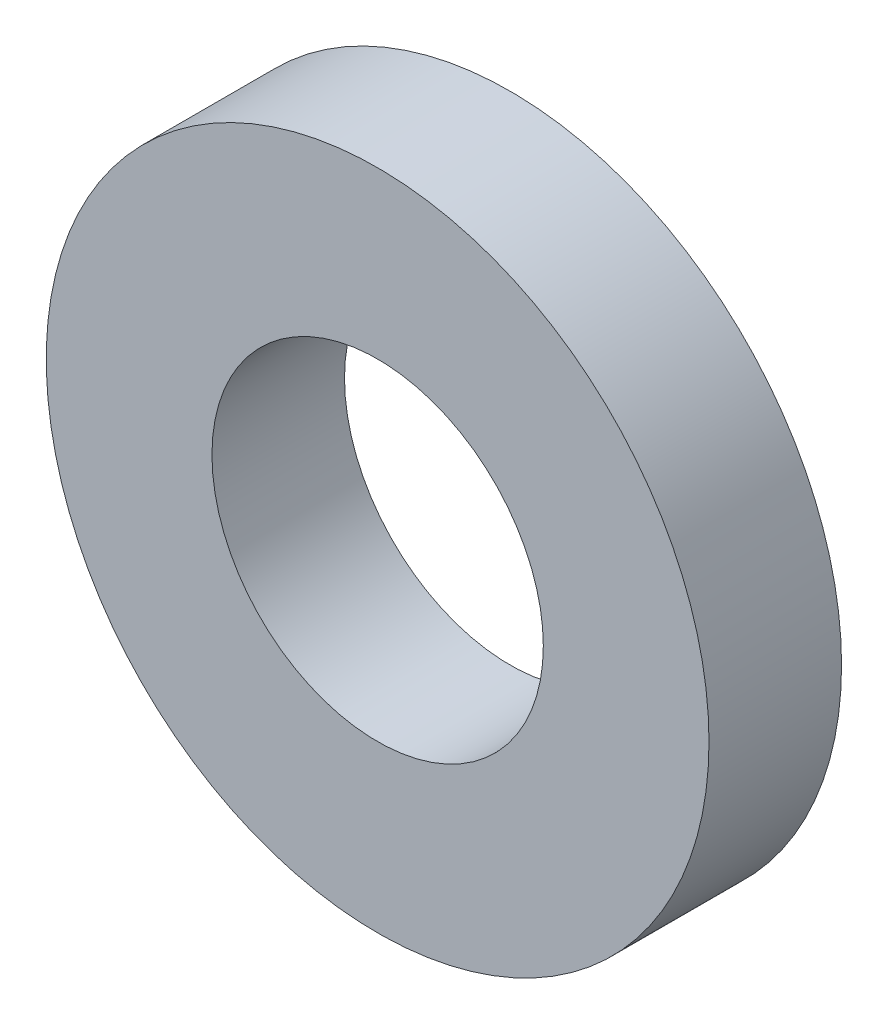
ISO-10303-21;
HEADER;
FILE_DESCRIPTION(('STEP AP214'),'2;1');
FILE_NAME('part.step','',(''),(''),'','','');
FILE_SCHEMA(('AUTOMOTIVE_DESIGN { 1 0 10303 214 1 1 1 1 }'));
ENDSEC;
DATA;
#1=APPLICATION_CONTEXT('core data for automotive mechanical design processes');
#2=APPLICATION_PROTOCOL_DEFINITION('international standard','automotive_design',2000,#1);
#3=PRODUCT_CONTEXT('',#1,'mechanical');
#4=PRODUCT('Part','Part','',(#3));
#5=PRODUCT_RELATED_PRODUCT_CATEGORY('part','',(#4));
#6=PRODUCT_DEFINITION_FORMATION('','',#4);
#7=PRODUCT_DEFINITION_CONTEXT('part definition',#1,'design');
#8=PRODUCT_DEFINITION('design','',#6,#7);
#9=PRODUCT_DEFINITION_SHAPE('','',#8);
#10=(LENGTH_UNIT() NAMED_UNIT(*) SI_UNIT(.MILLI.,.METRE.));
#11=(NAMED_UNIT(*) PLANE_ANGLE_UNIT() SI_UNIT($,.RADIAN.));
#12=(NAMED_UNIT(*) SI_UNIT($,.STERADIAN.) SOLID_ANGLE_UNIT());
#13=UNCERTAINTY_MEASURE_WITH_UNIT(LENGTH_MEASURE(1.E-05),#10,'distance_accuracy_value','');
#14=(GEOMETRIC_REPRESENTATION_CONTEXT(3) GLOBAL_UNCERTAINTY_ASSIGNED_CONTEXT((#13)) GLOBAL_UNIT_ASSIGNED_CONTEXT((#10,
#11,#12)) REPRESENTATION_CONTEXT('',''));
#15=CARTESIAN_POINT('',(0.,0.,0.));
#16=DIRECTION('',(0.,0.,1.));
#17=DIRECTION('',(1.,0.,0.));
#18=AXIS2_PLACEMENT_3D('',#15,#16,#17);
#19=CARTESIAN_POINT('',(0.,0.,2.));
#20=DIRECTION('',(0.,0.,-1.));
#21=DIRECTION('',(-1.,0.,0.));
#22=AXIS2_PLACEMENT_3D('',#19,#20,#21);
#23=CYLINDRICAL_SURFACE('',#22,5.);
#24=CARTESIAN_POINT('',(0.,0.,2.));
#25=DIRECTION('',(0.,0.,1.));
#26=DIRECTION('',(1.,0.,0.));
#27=AXIS2_PLACEMENT_3D('',#24,#25,#26);
#28=CIRCLE('',#27,5.);
#29=CARTESIAN_POINT('',(5.,0.,2.));
#30=VERTEX_POINT('',#29);
#31=EDGE_CURVE('E10',#30,#30,#28,.T.);
#32=ORIENTED_EDGE('',*,*,#31,.F.);
#33=EDGE_LOOP('',(#32));
#34=FACE_BOUND('',#33,.T.);
#35=CARTESIAN_POINT('',(0.,0.,0.));
#36=DIRECTION('',(0.,0.,1.));
#37=DIRECTION('',(1.,0.,0.));
#38=AXIS2_PLACEMENT_3D('',#35,#36,#37);
#39=CIRCLE('',#38,5.);
#40=CARTESIAN_POINT('',(5.,0.,0.));
#41=VERTEX_POINT('',#40);
#42=EDGE_CURVE('E44',#41,#41,#39,.T.);
#43=ORIENTED_EDGE('',*,*,#42,.T.);
#44=EDGE_LOOP('',(#43));
#45=FACE_BOUND('',#44,.T.);
#46=ADVANCED_FACE('F41',(#34,#45),#23,.T.);
#47=CARTESIAN_POINT('',(0.,0.,2.));
#48=DIRECTION('',(0.,0.,1.));
#49=DIRECTION('',(1.,0.,0.));
#50=AXIS2_PLACEMENT_3D('',#47,#48,#49);
#51=PLANE('',#50);
#52=CARTESIAN_POINT('',(0.,0.,2.));
#53=DIRECTION('',(0.,0.,1.));
#54=DIRECTION('',(1.,0.,0.));
#55=AXIS2_PLACEMENT_3D('',#52,#53,#54);
#56=CIRCLE('',#55,2.5);
#57=CARTESIAN_POINT('',(2.5,0.,2.));
#58=VERTEX_POINT('',#57);
#59=EDGE_CURVE('E55',#58,#58,#56,.T.);
#60=ORIENTED_EDGE('',*,*,#59,.F.);
#61=EDGE_LOOP('',(#60));
#62=FACE_BOUND('',#61,.T.);
#63=ORIENTED_EDGE('',*,*,#31,.T.);
#64=EDGE_LOOP('',(#63));
#65=FACE_BOUND('',#64,.T.);
#66=ADVANCED_FACE('F72',(#62,#65),#51,.T.);
#67=CARTESIAN_POINT('',(0.,0.,0.));
#68=DIRECTION('',(0.,0.,1.));
#69=DIRECTION('',(1.,0.,0.));
#70=AXIS2_PLACEMENT_3D('',#67,#68,#69);
#71=PLANE('',#70);
#72=CARTESIAN_POINT('',(0.,0.,0.));
#73=DIRECTION('',(0.,0.,1.));
#74=DIRECTION('',(1.,0.,0.));
#75=AXIS2_PLACEMENT_3D('',#72,#73,#74);
#76=CIRCLE('',#75,2.5);
#77=CARTESIAN_POINT('',(2.5,0.,0.));
#78=VERTEX_POINT('',#77);
#79=EDGE_CURVE('E53',#78,#78,#76,.T.);
#80=ORIENTED_EDGE('',*,*,#79,.T.);
#81=EDGE_LOOP('',(#80));
#82=FACE_BOUND('',#81,.T.);
#83=ORIENTED_EDGE('',*,*,#42,.F.);
#84=EDGE_LOOP('',(#83));
#85=FACE_BOUND('',#84,.T.);
#86=ADVANCED_FACE('F63',(#82,#85),#71,.F.);
#87=CARTESIAN_POINT('',(0.,0.,0.));
#88=DIRECTION('',(0.,0.,1.));
#89=DIRECTION('',(1.,0.,0.));
#90=AXIS2_PLACEMENT_3D('',#87,#88,#89);
#91=CYLINDRICAL_SURFACE('',#90,2.5);
#92=ORIENTED_EDGE('',*,*,#79,.F.);
#93=EDGE_LOOP('',(#92));
#94=FACE_BOUND('',#93,.T.);
#95=ORIENTED_EDGE('',*,*,#59,.T.);
#96=EDGE_LOOP('',(#95));
#97=FACE_BOUND('',#96,.T.);
#98=ADVANCED_FACE('F66',(#94,#97),#91,.F.);
#99=CLOSED_SHELL('',(#46,#66,#86,#98));
#100=MANIFOLD_SOLID_BREP('B2',#99);
#101=ADVANCED_BREP_SHAPE_REPRESENTATION('',(#18,#100),#14);
#102=SHAPE_DEFINITION_REPRESENTATION(#9,#101);
ENDSEC;
END-ISO-10303-21;
